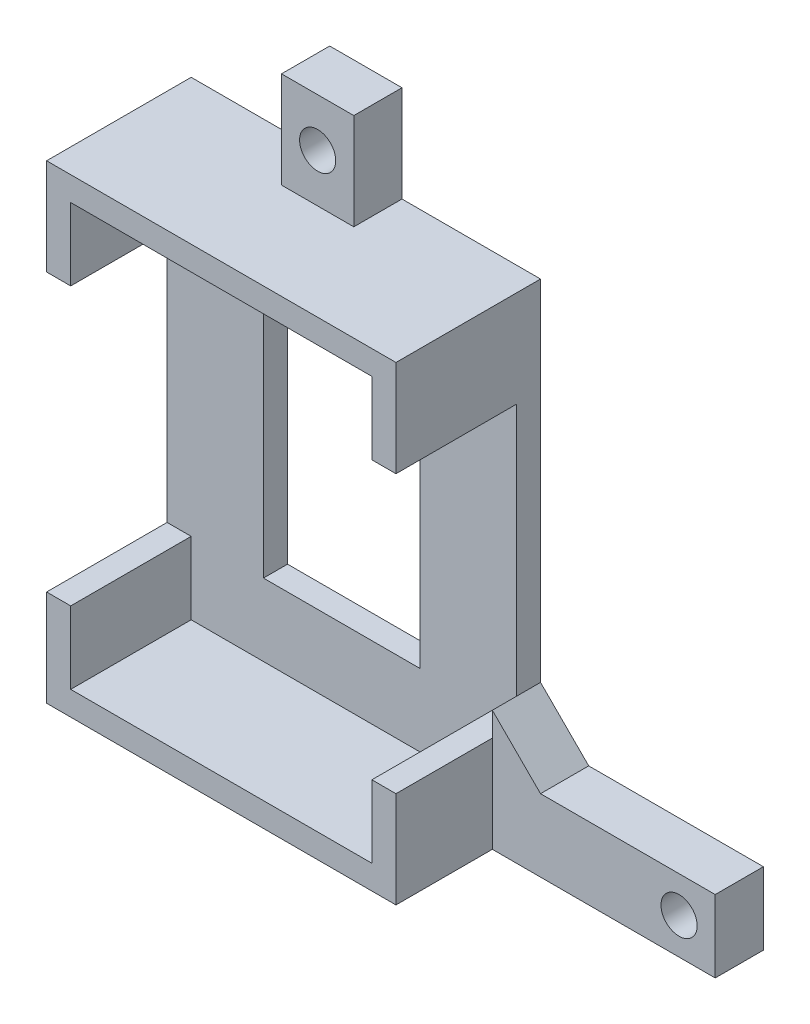
ISO-10303-21;
HEADER;
FILE_DESCRIPTION(('STEP AP214'),'2;1');
FILE_NAME('part.step','',(''),(''),'','','');
FILE_SCHEMA(('AUTOMOTIVE_DESIGN { 1 0 10303 214 1 1 1 1 }'));
ENDSEC;
DATA;
#1=APPLICATION_CONTEXT('core data for automotive mechanical design processes');
#2=APPLICATION_PROTOCOL_DEFINITION('international standard','automotive_design',2000,#1);
#3=PRODUCT_CONTEXT('',#1,'mechanical');
#4=PRODUCT('Part','Part','',(#3));
#5=PRODUCT_RELATED_PRODUCT_CATEGORY('part','',(#4));
#6=PRODUCT_DEFINITION_FORMATION('','',#4);
#7=PRODUCT_DEFINITION_CONTEXT('part definition',#1,'design');
#8=PRODUCT_DEFINITION('design','',#6,#7);
#9=PRODUCT_DEFINITION_SHAPE('','',#8);
#10=(LENGTH_UNIT() NAMED_UNIT(*) SI_UNIT(.MILLI.,.METRE.));
#11=(NAMED_UNIT(*) PLANE_ANGLE_UNIT() SI_UNIT($,.RADIAN.));
#12=(NAMED_UNIT(*) SI_UNIT($,.STERADIAN.) SOLID_ANGLE_UNIT());
#13=UNCERTAINTY_MEASURE_WITH_UNIT(LENGTH_MEASURE(1.E-05),#10,'distance_accuracy_value','');
#14=(GEOMETRIC_REPRESENTATION_CONTEXT(3) GLOBAL_UNCERTAINTY_ASSIGNED_CONTEXT((#13)) GLOBAL_UNIT_ASSIGNED_CONTEXT((#10,
#11,#12)) REPRESENTATION_CONTEXT('',''));
#15=CARTESIAN_POINT('',(0.,0.,0.));
#16=DIRECTION('',(0.,0.,1.));
#17=DIRECTION('',(1.,0.,0.));
#18=AXIS2_PLACEMENT_3D('',#15,#16,#17);
#19=CARTESIAN_POINT('',(-27.,0.,10.));
#20=DIRECTION('',(1.,0.,0.));
#21=DIRECTION('',(0.,0.,-1.));
#22=AXIS2_PLACEMENT_3D('',#19,#20,#21);
#23=PLANE('',#22);
#24=DIRECTION('',(0.,-1.,0.));
#25=VECTOR('',#24,1.);
#26=CARTESIAN_POINT('',(-27.,0.,10.));
#27=LINE('',#26,#25);
#28=CARTESIAN_POINT('',(-27.,6.,10.));
#29=VERTEX_POINT('',#28);
#30=CARTESIAN_POINT('',(-27.,-2.,10.));
#31=VERTEX_POINT('',#30);
#32=EDGE_CURVE('E154',#29,#31,#27,.T.);
#33=ORIENTED_EDGE('',*,*,#32,.F.);
#34=DIRECTION('',(0.,0.,1.));
#35=VECTOR('',#34,1.);
#36=CARTESIAN_POINT('',(-27.,6.,0.));
#37=LINE('',#36,#35);
#38=CARTESIAN_POINT('',(-27.,6.,0.));
#39=VERTEX_POINT('',#38);
#40=EDGE_CURVE('E134',#39,#29,#37,.T.);
#41=ORIENTED_EDGE('',*,*,#40,.F.);
#42=DIRECTION('',(0.,-1.,0.));
#43=VECTOR('',#42,1.);
#44=CARTESIAN_POINT('',(-27.,0.,0.));
#45=LINE('',#44,#43);
#46=CARTESIAN_POINT('',(-27.,-2.,0.));
#47=VERTEX_POINT('',#46);
#48=EDGE_CURVE('E147',#39,#47,#45,.T.);
#49=ORIENTED_EDGE('',*,*,#48,.T.);
#50=DIRECTION('',(0.,0.,-1.));
#51=VECTOR('',#50,1.);
#52=CARTESIAN_POINT('',(-27.,-2.,10.));
#53=LINE('',#52,#51);
#54=EDGE_CURVE('E162',#31,#47,#53,.T.);
#55=ORIENTED_EDGE('',*,*,#54,.F.);
#56=EDGE_LOOP('',(#33,#41,#49,#55));
#57=FACE_BOUND('',#56,.T.);
#58=ADVANCED_FACE('F69',(#57),#23,.F.);
#59=CARTESIAN_POINT('',(-25.,0.,10.));
#60=DIRECTION('',(1.,0.,0.));
#61=DIRECTION('',(0.,0.,-1.));
#62=AXIS2_PLACEMENT_3D('',#59,#60,#61);
#63=PLANE('',#62);
#64=DIRECTION('',(0.,0.,1.));
#65=VECTOR('',#64,1.);
#66=CARTESIAN_POINT('',(-25.,6.,0.));
#67=LINE('',#66,#65);
#68=CARTESIAN_POINT('',(-25.,6.,0.));
#69=VERTEX_POINT('',#68);
#70=CARTESIAN_POINT('',(-25.,6.,10.));
#71=VERTEX_POINT('',#70);
#72=EDGE_CURVE('E131',#69,#71,#67,.T.);
#73=ORIENTED_EDGE('',*,*,#72,.T.);
#74=DIRECTION('',(0.,-1.,0.));
#75=VECTOR('',#74,1.);
#76=CARTESIAN_POINT('',(-25.,0.,10.));
#77=LINE('',#76,#75);
#78=CARTESIAN_POINT('',(-25.,0.,10.));
#79=VERTEX_POINT('',#78);
#80=EDGE_CURVE('E144',#71,#79,#77,.T.);
#81=ORIENTED_EDGE('',*,*,#80,.T.);
#82=DIRECTION('',(0.,0.,-1.));
#83=VECTOR('',#82,1.);
#84=CARTESIAN_POINT('',(-25.,0.,10.));
#85=LINE('',#84,#83);
#86=CARTESIAN_POINT('',(-25.,0.,0.));
#87=VERTEX_POINT('',#86);
#88=EDGE_CURVE('E152',#79,#87,#85,.T.);
#89=ORIENTED_EDGE('',*,*,#88,.T.);
#90=DIRECTION('',(0.,-1.,0.));
#91=VECTOR('',#90,1.);
#92=CARTESIAN_POINT('',(-25.,0.,0.));
#93=LINE('',#92,#91);
#94=EDGE_CURVE('E146',#69,#87,#93,.T.);
#95=ORIENTED_EDGE('',*,*,#94,.F.);
#96=EDGE_LOOP('',(#73,#81,#89,#95));
#97=FACE_BOUND('',#96,.T.);
#98=ADVANCED_FACE('F142',(#97),#63,.T.);
#99=CARTESIAN_POINT('',(0.,0.,10.));
#100=DIRECTION('',(0.,0.,1.));
#101=DIRECTION('',(1.,0.,0.));
#102=AXIS2_PLACEMENT_3D('',#99,#100,#101);
#103=PLANE('',#102);
#104=DIRECTION('',(1.,0.,0.));
#105=VECTOR('',#104,1.);
#106=CARTESIAN_POINT('',(0.,6.,10.));
#107=LINE('',#106,#105);
#108=CARTESIAN_POINT('',(0.,6.,10.));
#109=VERTEX_POINT('',#108);
#110=CARTESIAN_POINT('',(2.,6.,10.));
#111=VERTEX_POINT('',#110);
#112=EDGE_CURVE('E79',#109,#111,#107,.T.);
#113=ORIENTED_EDGE('',*,*,#112,.F.);
#114=DIRECTION('',(0.,1.,0.));
#115=VECTOR('',#114,1.);
#116=CARTESIAN_POINT('',(0.,0.,10.));
#117=LINE('',#116,#115);
#118=CARTESIAN_POINT('',(0.,0.,10.));
#119=VERTEX_POINT('',#118);
#120=EDGE_CURVE('E160',#119,#109,#117,.T.);
#121=ORIENTED_EDGE('',*,*,#120,.F.);
#122=DIRECTION('',(1.,0.,0.));
#123=VECTOR('',#122,1.);
#124=CARTESIAN_POINT('',(0.,0.,10.));
#125=LINE('',#124,#123);
#126=EDGE_CURVE('E151',#79,#119,#125,.T.);
#127=ORIENTED_EDGE('',*,*,#126,.F.);
#128=ORIENTED_EDGE('',*,*,#80,.F.);
#129=DIRECTION('',(1.,0.,0.));
#130=VECTOR('',#129,1.);
#131=CARTESIAN_POINT('',(-25.,6.,10.));
#132=LINE('',#131,#130);
#133=EDGE_CURVE('E128',#29,#71,#132,.T.);
#134=ORIENTED_EDGE('',*,*,#133,.F.);
#135=ORIENTED_EDGE('',*,*,#32,.T.);
#136=DIRECTION('',(1.,0.,0.));
#137=VECTOR('',#136,1.);
#138=CARTESIAN_POINT('',(0.,-2.,10.));
#139=LINE('',#138,#137);
#140=CARTESIAN_POINT('',(2.,-2.,10.));
#141=VERTEX_POINT('',#140);
#142=EDGE_CURVE('E180',#31,#141,#139,.T.);
#143=ORIENTED_EDGE('',*,*,#142,.T.);
#144=DIRECTION('',(0.,1.,0.));
#145=VECTOR('',#144,1.);
#146=CARTESIAN_POINT('',(2.,0.,10.));
#147=LINE('',#146,#145);
#148=EDGE_CURVE('E181',#141,#111,#147,.T.);
#149=ORIENTED_EDGE('',*,*,#148,.T.);
#150=EDGE_LOOP('',(#113,#121,#127,#128,#134,#135,#143,#149));
#151=FACE_BOUND('',#150,.T.);
#152=ADVANCED_FACE('F71',(#151),#103,.T.);
#153=CARTESIAN_POINT('',(0.,0.,0.));
#154=DIRECTION('',(0.,0.,1.));
#155=DIRECTION('',(1.,0.,0.));
#156=AXIS2_PLACEMENT_3D('',#153,#154,#155);
#157=PLANE('',#156);
#158=DIRECTION('',(0.,1.,0.));
#159=VECTOR('',#158,1.);
#160=CARTESIAN_POINT('',(0.,0.,0.));
#161=LINE('',#160,#159);
#162=CARTESIAN_POINT('',(0.,0.,0.));
#163=VERTEX_POINT('',#162);
#164=CARTESIAN_POINT('',(0.,6.,0.));
#165=VERTEX_POINT('',#164);
#166=EDGE_CURVE('E73',#163,#165,#161,.T.);
#167=ORIENTED_EDGE('',*,*,#166,.T.);
#168=DIRECTION('',(1.,0.,0.));
#169=VECTOR('',#168,1.);
#170=CARTESIAN_POINT('',(0.,6.,0.));
#171=LINE('',#170,#169);
#172=CARTESIAN_POINT('',(2.,6.,0.));
#173=VERTEX_POINT('',#172);
#174=EDGE_CURVE('E168',#165,#173,#171,.T.);
#175=ORIENTED_EDGE('',*,*,#174,.T.);
#176=DIRECTION('',(0.,1.,0.));
#177=VECTOR('',#176,1.);
#178=CARTESIAN_POINT('',(2.,0.,0.));
#179=LINE('',#178,#177);
#180=CARTESIAN_POINT('',(2.,-2.,0.));
#181=VERTEX_POINT('',#180);
#182=EDGE_CURVE('E158',#181,#173,#179,.T.);
#183=ORIENTED_EDGE('',*,*,#182,.F.);
#184=DIRECTION('',(1.,0.,0.));
#185=VECTOR('',#184,1.);
#186=CARTESIAN_POINT('',(0.,-2.,0.));
#187=LINE('',#186,#185);
#188=EDGE_CURVE('E191',#47,#181,#187,.T.);
#189=ORIENTED_EDGE('',*,*,#188,.F.);
#190=ORIENTED_EDGE('',*,*,#48,.F.);
#191=DIRECTION('',(1.,0.,0.));
#192=VECTOR('',#191,1.);
#193=CARTESIAN_POINT('',(-25.,6.,0.));
#194=LINE('',#193,#192);
#195=EDGE_CURVE('E164',#39,#69,#194,.T.);
#196=ORIENTED_EDGE('',*,*,#195,.T.);
#197=ORIENTED_EDGE('',*,*,#94,.T.);
#198=DIRECTION('',(1.,0.,0.));
#199=VECTOR('',#198,1.);
#200=CARTESIAN_POINT('',(0.,0.,0.));
#201=LINE('',#200,#199);
#202=EDGE_CURVE('E163',#87,#163,#201,.T.);
#203=ORIENTED_EDGE('',*,*,#202,.T.);
#204=EDGE_LOOP('',(#167,#175,#183,#189,#190,#196,#197,#203));
#205=FACE_BOUND('',#204,.T.);
#206=ADVANCED_FACE('F196',(#205),#157,.F.);
#207=CARTESIAN_POINT('',(2.,0.,10.));
#208=DIRECTION('',(-1.,0.,0.));
#209=DIRECTION('',(0.,-1.,0.));
#210=AXIS2_PLACEMENT_3D('',#207,#208,#209);
#211=PLANE('',#210);
#212=ORIENTED_EDGE('',*,*,#182,.T.);
#213=DIRECTION('',(0.,0.,1.));
#214=VECTOR('',#213,1.);
#215=CARTESIAN_POINT('',(2.,6.,0.));
#216=LINE('',#215,#214);
#217=EDGE_CURVE('E174',#173,#111,#216,.T.);
#218=ORIENTED_EDGE('',*,*,#217,.T.);
#219=ORIENTED_EDGE('',*,*,#148,.F.);
#220=DIRECTION('',(0.,0.,-1.));
#221=VECTOR('',#220,1.);
#222=CARTESIAN_POINT('',(2.,-2.,10.));
#223=LINE('',#222,#221);
#224=EDGE_CURVE('E177',#141,#181,#223,.T.);
#225=ORIENTED_EDGE('',*,*,#224,.T.);
#226=EDGE_LOOP('',(#212,#218,#219,#225));
#227=FACE_BOUND('',#226,.T.);
#228=ADVANCED_FACE('F215',(#227),#211,.F.);
#229=CARTESIAN_POINT('',(0.,-2.,10.));
#230=DIRECTION('',(0.,1.,0.));
#231=DIRECTION('',(0.,0.,1.));
#232=AXIS2_PLACEMENT_3D('',#229,#230,#231);
#233=PLANE('',#232);
#234=ORIENTED_EDGE('',*,*,#188,.T.);
#235=ORIENTED_EDGE('',*,*,#224,.F.);
#236=ORIENTED_EDGE('',*,*,#142,.F.);
#237=ORIENTED_EDGE('',*,*,#54,.T.);
#238=EDGE_LOOP('',(#234,#235,#236,#237));
#239=FACE_BOUND('',#238,.T.);
#240=ADVANCED_FACE('F189',(#239),#233,.F.);
#241=CARTESIAN_POINT('',(0.,0.,10.));
#242=DIRECTION('',(-1.,0.,0.));
#243=DIRECTION('',(0.,-1.,0.));
#244=AXIS2_PLACEMENT_3D('',#241,#242,#243);
#245=PLANE('',#244);
#246=DIRECTION('',(0.,0.,1.));
#247=VECTOR('',#246,1.);
#248=CARTESIAN_POINT('',(0.,6.,0.));
#249=LINE('',#248,#247);
#250=EDGE_CURVE('E13',#165,#109,#249,.T.);
#251=ORIENTED_EDGE('',*,*,#250,.F.);
#252=ORIENTED_EDGE('',*,*,#166,.F.);
#253=DIRECTION('',(0.,0.,-1.));
#254=VECTOR('',#253,1.);
#255=CARTESIAN_POINT('',(0.,0.,10.));
#256=LINE('',#255,#254);
#257=EDGE_CURVE('E138',#119,#163,#256,.T.);
#258=ORIENTED_EDGE('',*,*,#257,.F.);
#259=ORIENTED_EDGE('',*,*,#120,.T.);
#260=EDGE_LOOP('',(#251,#252,#258,#259));
#261=FACE_BOUND('',#260,.T.);
#262=ADVANCED_FACE('F210',(#261),#245,.T.);
#263=CARTESIAN_POINT('',(0.,0.,10.));
#264=DIRECTION('',(0.,1.,0.));
#265=DIRECTION('',(0.,0.,1.));
#266=AXIS2_PLACEMENT_3D('',#263,#264,#265);
#267=PLANE('',#266);
#268=ORIENTED_EDGE('',*,*,#202,.F.);
#269=ORIENTED_EDGE('',*,*,#88,.F.);
#270=ORIENTED_EDGE('',*,*,#126,.T.);
#271=ORIENTED_EDGE('',*,*,#257,.T.);
#272=EDGE_LOOP('',(#268,#269,#270,#271));
#273=FACE_BOUND('',#272,.T.);
#274=ADVANCED_FACE('F208',(#273),#267,.T.);
#275=CARTESIAN_POINT('',(-25.,6.,0.));
#276=DIRECTION('',(0.,-1.,0.));
#277=DIRECTION('',(0.,0.,-1.));
#278=AXIS2_PLACEMENT_3D('',#275,#276,#277);
#279=PLANE('',#278);
#280=ORIENTED_EDGE('',*,*,#133,.T.);
#281=ORIENTED_EDGE('',*,*,#72,.F.);
#282=ORIENTED_EDGE('',*,*,#195,.F.);
#283=ORIENTED_EDGE('',*,*,#40,.T.);
#284=EDGE_LOOP('',(#280,#281,#282,#283));
#285=FACE_BOUND('',#284,.T.);
#286=ADVANCED_FACE('F130',(#285),#279,.F.);
#287=CARTESIAN_POINT('',(0.,6.,0.));
#288=DIRECTION('',(0.,-1.,0.));
#289=DIRECTION('',(0.,0.,-1.));
#290=AXIS2_PLACEMENT_3D('',#287,#288,#289);
#291=PLANE('',#290);
#292=ORIENTED_EDGE('',*,*,#112,.T.);
#293=ORIENTED_EDGE('',*,*,#217,.F.);
#294=ORIENTED_EDGE('',*,*,#174,.F.);
#295=ORIENTED_EDGE('',*,*,#250,.T.);
#296=EDGE_LOOP('',(#292,#293,#294,#295));
#297=FACE_BOUND('',#296,.T.);
#298=ADVANCED_FACE('F213',(#297),#291,.F.);
#299=CLOSED_SHELL('',(#58,#98,#152,#206,#228,#240,#262,#274,#286,#298));
#300=MANIFOLD_SOLID_BREP('B2',#299);
#301=CARTESIAN_POINT('',(0.,37.,10.));
#302=DIRECTION('',(0.,-1.,0.));
#303=DIRECTION('',(0.,0.,-1.));
#304=AXIS2_PLACEMENT_3D('',#301,#302,#303);
#305=PLANE('',#304);
#306=DIRECTION('',(0.,0.,-1.));
#307=VECTOR('',#306,1.);
#308=CARTESIAN_POINT('',(-9.5,37.,2.));
#309=LINE('',#308,#307);
#310=CARTESIAN_POINT('',(-9.5,37.,2.));
#311=VERTEX_POINT('',#310);
#312=CARTESIAN_POINT('',(-9.5,37.,-2.));
#313=VERTEX_POINT('',#312);
#314=EDGE_CURVE('E539',#311,#313,#309,.T.);
#315=ORIENTED_EDGE('',*,*,#314,.F.);
#316=DIRECTION('',(-1.,0.,0.));
#317=VECTOR('',#316,1.);
#318=CARTESIAN_POINT('',(-9.5,37.,2.));
#319=LINE('',#318,#317);
#320=CARTESIAN_POINT('',(-15.5,37.,2.));
#321=VERTEX_POINT('',#320);
#322=EDGE_CURVE('E529',#311,#321,#319,.T.);
#323=ORIENTED_EDGE('',*,*,#322,.T.);
#324=DIRECTION('',(0.,0.,-1.));
#325=VECTOR('',#324,1.);
#326=CARTESIAN_POINT('',(-15.5,37.,2.));
#327=LINE('',#326,#325);
#328=CARTESIAN_POINT('',(-15.5,37.,-2.));
#329=VERTEX_POINT('',#328);
#330=EDGE_CURVE('E552',#321,#329,#327,.T.);
#331=ORIENTED_EDGE('',*,*,#330,.T.);
#332=DIRECTION('',(1.,0.,0.));
#333=VECTOR('',#332,1.);
#334=CARTESIAN_POINT('',(-27.,37.,-2.));
#335=LINE('',#334,#333);
#336=CARTESIAN_POINT('',(-27.,37.,-2.));
#337=VERTEX_POINT('',#336);
#338=EDGE_CURVE('E561',#337,#329,#335,.T.);
#339=ORIENTED_EDGE('',*,*,#338,.F.);
#340=DIRECTION('',(0.,0.,-1.));
#341=VECTOR('',#340,1.);
#342=CARTESIAN_POINT('',(-27.,37.,10.));
#343=LINE('',#342,#341);
#344=CARTESIAN_POINT('',(-27.,37.,10.));
#345=VERTEX_POINT('',#344);
#346=EDGE_CURVE('E627',#345,#337,#343,.T.);
#347=ORIENTED_EDGE('',*,*,#346,.F.);
#348=DIRECTION('',(-1.,0.,0.));
#349=VECTOR('',#348,1.);
#350=CARTESIAN_POINT('',(0.,37.,10.));
#351=LINE('',#350,#349);
#352=CARTESIAN_POINT('',(2.,37.,10.));
#353=VERTEX_POINT('',#352);
#354=EDGE_CURVE('E622',#353,#345,#351,.T.);
#355=ORIENTED_EDGE('',*,*,#354,.F.);
#356=DIRECTION('',(0.,0.,-1.));
#357=VECTOR('',#356,1.);
#358=CARTESIAN_POINT('',(2.,37.,10.));
#359=LINE('',#358,#357);
#360=CARTESIAN_POINT('',(2.,37.,-2.));
#361=VERTEX_POINT('',#360);
#362=EDGE_CURVE('E629',#353,#361,#359,.T.);
#363=ORIENTED_EDGE('',*,*,#362,.T.);
#364=EDGE_CURVE('E559',#313,#361,#335,.T.);
#365=ORIENTED_EDGE('',*,*,#364,.F.);
#366=EDGE_LOOP('',(#315,#323,#331,#339,#347,#355,#363,#365));
#367=FACE_BOUND('',#366,.T.);
#368=ADVANCED_FACE('F297',(#367),#305,.F.);
#369=CARTESIAN_POINT('',(0.,35.,10.));
#370=DIRECTION('',(0.,-1.,0.));
#371=DIRECTION('',(0.,0.,-1.));
#372=AXIS2_PLACEMENT_3D('',#369,#370,#371);
#373=PLANE('',#372);
#374=DIRECTION('',(-1.,0.,0.));
#375=VECTOR('',#374,1.);
#376=CARTESIAN_POINT('',(0.,35.,0.));
#377=LINE('',#376,#375);
#378=CARTESIAN_POINT('',(0.,35.,0.));
#379=VERTEX_POINT('',#378);
#380=CARTESIAN_POINT('',(-25.,35.,0.));
#381=VERTEX_POINT('',#380);
#382=EDGE_CURVE('E611',#379,#381,#377,.T.);
#383=ORIENTED_EDGE('',*,*,#382,.F.);
#384=DIRECTION('',(0.,0.,-1.));
#385=VECTOR('',#384,1.);
#386=CARTESIAN_POINT('',(0.,35.,10.));
#387=LINE('',#386,#385);
#388=CARTESIAN_POINT('',(0.,35.,10.));
#389=VERTEX_POINT('',#388);
#390=EDGE_CURVE('E617',#389,#379,#387,.T.);
#391=ORIENTED_EDGE('',*,*,#390,.F.);
#392=DIRECTION('',(-1.,0.,0.));
#393=VECTOR('',#392,1.);
#394=CARTESIAN_POINT('',(0.,35.,10.));
#395=LINE('',#394,#393);
#396=CARTESIAN_POINT('',(-25.,35.,10.));
#397=VERTEX_POINT('',#396);
#398=EDGE_CURVE('E602',#389,#397,#395,.T.);
#399=ORIENTED_EDGE('',*,*,#398,.T.);
#400=DIRECTION('',(0.,0.,-1.));
#401=VECTOR('',#400,1.);
#402=CARTESIAN_POINT('',(-25.,35.,10.));
#403=LINE('',#402,#401);
#404=EDGE_CURVE('E608',#397,#381,#403,.T.);
#405=ORIENTED_EDGE('',*,*,#404,.T.);
#406=EDGE_LOOP('',(#383,#391,#399,#405));
#407=FACE_BOUND('',#406,.T.);
#408=ADVANCED_FACE('F656',(#407),#373,.T.);
#409=CARTESIAN_POINT('',(-27.,0.,10.));
#410=DIRECTION('',(1.,0.,0.));
#411=DIRECTION('',(0.,0.,-1.));
#412=AXIS2_PLACEMENT_3D('',#409,#410,#411);
#413=PLANE('',#412);
#414=ORIENTED_EDGE('',*,*,#346,.T.);
#415=DIRECTION('',(0.,1.,0.));
#416=VECTOR('',#415,1.);
#417=CARTESIAN_POINT('',(-27.,-2.,-2.));
#418=LINE('',#417,#416);
#419=CARTESIAN_POINT('',(-27.,-2.,-2.));
#420=VERTEX_POINT('',#419);
#421=EDGE_CURVE('E556',#420,#337,#418,.T.);
#422=ORIENTED_EDGE('',*,*,#421,.F.);
#423=DIRECTION('',(0.,0.,1.));
#424=VECTOR('',#423,1.);
#425=CARTESIAN_POINT('',(-27.,-2.,-2.));
#426=LINE('',#425,#424);
#427=CARTESIAN_POINT('',(-27.,-2.,0.));
#428=VERTEX_POINT('',#427);
#429=EDGE_CURVE('E569',#420,#428,#426,.T.);
#430=ORIENTED_EDGE('',*,*,#429,.T.);
#431=DIRECTION('',(0.,1.,0.));
#432=VECTOR('',#431,1.);
#433=CARTESIAN_POINT('',(-27.,-2.,0.));
#434=LINE('',#433,#432);
#435=CARTESIAN_POINT('',(-27.,29.,0.));
#436=VERTEX_POINT('',#435);
#437=EDGE_CURVE('E549',#428,#436,#434,.T.);
#438=ORIENTED_EDGE('',*,*,#437,.T.);
#439=DIRECTION('',(0.,0.,1.));
#440=VECTOR('',#439,1.);
#441=CARTESIAN_POINT('',(-27.,29.,0.));
#442=LINE('',#441,#440);
#443=CARTESIAN_POINT('',(-27.,29.,10.));
#444=VERTEX_POINT('',#443);
#445=EDGE_CURVE('E586',#436,#444,#442,.T.);
#446=ORIENTED_EDGE('',*,*,#445,.T.);
#447=DIRECTION('',(0.,-1.,0.));
#448=VECTOR('',#447,1.);
#449=CARTESIAN_POINT('',(-27.,0.,10.));
#450=LINE('',#449,#448);
#451=EDGE_CURVE('E624',#345,#444,#450,.T.);
#452=ORIENTED_EDGE('',*,*,#451,.F.);
#453=EDGE_LOOP('',(#414,#422,#430,#438,#446,#452));
#454=FACE_BOUND('',#453,.T.);
#455=ADVANCED_FACE('F661',(#454),#413,.F.);
#456=CARTESIAN_POINT('',(-25.,0.,10.));
#457=DIRECTION('',(1.,0.,0.));
#458=DIRECTION('',(0.,0.,-1.));
#459=AXIS2_PLACEMENT_3D('',#456,#457,#458);
#460=PLANE('',#459);
#461=DIRECTION('',(0.,0.,1.));
#462=VECTOR('',#461,1.);
#463=CARTESIAN_POINT('',(-25.,29.,0.));
#464=LINE('',#463,#462);
#465=CARTESIAN_POINT('',(-25.,29.,0.));
#466=VERTEX_POINT('',#465);
#467=CARTESIAN_POINT('',(-25.,29.,10.));
#468=VERTEX_POINT('',#467);
#469=EDGE_CURVE('E595',#466,#468,#464,.T.);
#470=ORIENTED_EDGE('',*,*,#469,.F.);
#471=DIRECTION('',(0.,-1.,0.));
#472=VECTOR('',#471,1.);
#473=CARTESIAN_POINT('',(-25.,0.,0.));
#474=LINE('',#473,#472);
#475=EDGE_CURVE('E603',#381,#466,#474,.T.);
#476=ORIENTED_EDGE('',*,*,#475,.F.);
#477=ORIENTED_EDGE('',*,*,#404,.F.);
#478=DIRECTION('',(0.,-1.,0.));
#479=VECTOR('',#478,1.);
#480=CARTESIAN_POINT('',(-25.,0.,10.));
#481=LINE('',#480,#479);
#482=EDGE_CURVE('E605',#397,#468,#481,.T.);
#483=ORIENTED_EDGE('',*,*,#482,.T.);
#484=EDGE_LOOP('',(#470,#476,#477,#483));
#485=FACE_BOUND('',#484,.T.);
#486=ADVANCED_FACE('F668',(#485),#460,.T.);
#487=CARTESIAN_POINT('',(0.,0.,10.));
#488=DIRECTION('',(-1.,0.,0.));
#489=DIRECTION('',(0.,-1.,0.));
#490=AXIS2_PLACEMENT_3D('',#487,#488,#489);
#491=PLANE('',#490);
#492=DIRECTION('',(0.,0.,1.));
#493=VECTOR('',#492,1.);
#494=CARTESIAN_POINT('',(0.,29.,0.));
#495=LINE('',#494,#493);
#496=CARTESIAN_POINT('',(0.,29.,0.));
#497=VERTEX_POINT('',#496);
#498=CARTESIAN_POINT('',(0.,29.,10.));
#499=VERTEX_POINT('',#498);
#500=EDGE_CURVE('E587',#497,#499,#495,.T.);
#501=ORIENTED_EDGE('',*,*,#500,.T.);
#502=DIRECTION('',(0.,1.,0.));
#503=VECTOR('',#502,1.);
#504=CARTESIAN_POINT('',(0.,0.,10.));
#505=LINE('',#504,#503);
#506=EDGE_CURVE('E600',#499,#389,#505,.T.);
#507=ORIENTED_EDGE('',*,*,#506,.T.);
#508=ORIENTED_EDGE('',*,*,#390,.T.);
#509=DIRECTION('',(0.,1.,0.));
#510=VECTOR('',#509,1.);
#511=CARTESIAN_POINT('',(0.,0.,0.));
#512=LINE('',#511,#510);
#513=EDGE_CURVE('E590',#497,#379,#512,.T.);
#514=ORIENTED_EDGE('',*,*,#513,.F.);
#515=EDGE_LOOP('',(#501,#507,#508,#514));
#516=FACE_BOUND('',#515,.T.);
#517=ADVANCED_FACE('F675',(#516),#491,.T.);
#518=CARTESIAN_POINT('',(2.,0.,10.));
#519=DIRECTION('',(-1.,0.,0.));
#520=DIRECTION('',(0.,-1.,0.));
#521=AXIS2_PLACEMENT_3D('',#518,#519,#520);
#522=PLANE('',#521);
#523=DIRECTION('',(0.,-1.,0.));
#524=VECTOR('',#523,1.);
#525=CARTESIAN_POINT('',(2.,-2.,0.));
#526=LINE('',#525,#524);
#527=CARTESIAN_POINT('',(2.,29.,0.));
#528=VERTEX_POINT('',#527);
#529=CARTESIAN_POINT('',(2.,8.,0.));
#530=VERTEX_POINT('',#529);
#531=EDGE_CURVE('E573',#528,#530,#526,.T.);
#532=ORIENTED_EDGE('',*,*,#531,.T.);
#533=DIRECTION('',(0.,0.,-1.));
#534=VECTOR('',#533,1.);
#535=CARTESIAN_POINT('',(2.,8.,2.));
#536=LINE('',#535,#534);
#537=CARTESIAN_POINT('',(2.,8.,-2.));
#538=VERTEX_POINT('',#537);
#539=EDGE_CURVE('E519',#530,#538,#536,.T.);
#540=ORIENTED_EDGE('',*,*,#539,.T.);
#541=DIRECTION('',(0.,-1.,0.));
#542=VECTOR('',#541,1.);
#543=CARTESIAN_POINT('',(2.,-2.,-2.));
#544=LINE('',#543,#542);
#545=EDGE_CURVE('E564',#361,#538,#544,.T.);
#546=ORIENTED_EDGE('',*,*,#545,.F.);
#547=ORIENTED_EDGE('',*,*,#362,.F.);
#548=DIRECTION('',(0.,1.,0.));
#549=VECTOR('',#548,1.);
#550=CARTESIAN_POINT('',(2.,0.,10.));
#551=LINE('',#550,#549);
#552=CARTESIAN_POINT('',(2.,29.,10.));
#553=VERTEX_POINT('',#552);
#554=EDGE_CURVE('E620',#553,#353,#551,.T.);
#555=ORIENTED_EDGE('',*,*,#554,.F.);
#556=DIRECTION('',(0.,0.,1.));
#557=VECTOR('',#556,1.);
#558=CARTESIAN_POINT('',(2.,29.,0.));
#559=LINE('',#558,#557);
#560=EDGE_CURVE('E583',#528,#553,#559,.T.);
#561=ORIENTED_EDGE('',*,*,#560,.F.);
#562=EDGE_LOOP('',(#532,#540,#546,#547,#555,#561));
#563=FACE_BOUND('',#562,.T.);
#564=ADVANCED_FACE('F299',(#563),#522,.F.);
#565=CARTESIAN_POINT('',(0.,0.,10.));
#566=DIRECTION('',(0.,0.,1.));
#567=DIRECTION('',(1.,0.,0.));
#568=AXIS2_PLACEMENT_3D('',#565,#566,#567);
#569=PLANE('',#568);
#570=DIRECTION('',(-1.,0.,0.));
#571=VECTOR('',#570,1.);
#572=CARTESIAN_POINT('',(0.,29.,10.));
#573=LINE('',#572,#571);
#574=EDGE_CURVE('E584',#553,#499,#573,.T.);
#575=ORIENTED_EDGE('',*,*,#574,.F.);
#576=ORIENTED_EDGE('',*,*,#554,.T.);
#577=ORIENTED_EDGE('',*,*,#354,.T.);
#578=ORIENTED_EDGE('',*,*,#451,.T.);
#579=DIRECTION('',(-1.,0.,0.));
#580=VECTOR('',#579,1.);
#581=CARTESIAN_POINT('',(-25.,29.,10.));
#582=LINE('',#581,#580);
#583=EDGE_CURVE('E579',#468,#444,#582,.T.);
#584=ORIENTED_EDGE('',*,*,#583,.F.);
#585=ORIENTED_EDGE('',*,*,#482,.F.);
#586=ORIENTED_EDGE('',*,*,#398,.F.);
#587=ORIENTED_EDGE('',*,*,#506,.F.);
#588=EDGE_LOOP('',(#575,#576,#577,#578,#584,#585,#586,#587));
#589=FACE_BOUND('',#588,.T.);
#590=ADVANCED_FACE('F670',(#589),#569,.T.);
#591=CARTESIAN_POINT('',(-25.,29.,0.));
#592=DIRECTION('',(0.,1.,0.));
#593=DIRECTION('',(0.,0.,1.));
#594=AXIS2_PLACEMENT_3D('',#591,#592,#593);
#595=PLANE('',#594);
#596=ORIENTED_EDGE('',*,*,#583,.T.);
#597=ORIENTED_EDGE('',*,*,#445,.F.);
#598=DIRECTION('',(-1.,0.,0.));
#599=VECTOR('',#598,1.);
#600=CARTESIAN_POINT('',(-25.,29.,0.));
#601=LINE('',#600,#599);
#602=EDGE_CURVE('E592',#466,#436,#601,.T.);
#603=ORIENTED_EDGE('',*,*,#602,.F.);
#604=ORIENTED_EDGE('',*,*,#469,.T.);
#605=EDGE_LOOP('',(#596,#597,#603,#604));
#606=FACE_BOUND('',#605,.T.);
#607=ADVANCED_FACE('F673',(#606),#595,.F.);
#608=CARTESIAN_POINT('',(0.,29.,0.));
#609=DIRECTION('',(0.,1.,0.));
#610=DIRECTION('',(0.,0.,1.));
#611=AXIS2_PLACEMENT_3D('',#608,#609,#610);
#612=PLANE('',#611);
#613=ORIENTED_EDGE('',*,*,#574,.T.);
#614=ORIENTED_EDGE('',*,*,#500,.F.);
#615=DIRECTION('',(-1.,0.,0.));
#616=VECTOR('',#615,1.);
#617=CARTESIAN_POINT('',(0.,29.,0.));
#618=LINE('',#617,#616);
#619=EDGE_CURVE('E580',#528,#497,#618,.T.);
#620=ORIENTED_EDGE('',*,*,#619,.F.);
#621=ORIENTED_EDGE('',*,*,#560,.T.);
#622=EDGE_LOOP('',(#613,#614,#620,#621));
#623=FACE_BOUND('',#622,.T.);
#624=ADVANCED_FACE('F684',(#623),#612,.F.);
#625=CARTESIAN_POINT('',(0.,0.,0.));
#626=DIRECTION('',(0.,0.,-1.));
#627=DIRECTION('',(-1.,0.,0.));
#628=AXIS2_PLACEMENT_3D('',#625,#626,#627);
#629=PLANE('',#628);
#630=DIRECTION('',(1.,0.,0.));
#631=VECTOR('',#630,1.);
#632=CARTESIAN_POINT('',(-19.,6.,0.));
#633=LINE('',#632,#631);
#634=CARTESIAN_POINT('',(-19.,6.,0.));
#635=VERTEX_POINT('',#634);
#636=CARTESIAN_POINT('',(-6.,6.,0.));
#637=VERTEX_POINT('',#636);
#638=EDGE_CURVE('E460',#635,#637,#633,.T.);
#639=ORIENTED_EDGE('',*,*,#638,.F.);
#640=DIRECTION('',(0.,-1.,0.));
#641=VECTOR('',#640,1.);
#642=CARTESIAN_POINT('',(-19.,29.,0.));
#643=LINE('',#642,#641);
#644=CARTESIAN_POINT('',(-19.,29.,0.));
#645=VERTEX_POINT('',#644);
#646=EDGE_CURVE('E312',#645,#635,#643,.T.);
#647=ORIENTED_EDGE('',*,*,#646,.F.);
#648=DIRECTION('',(-1.,0.,0.));
#649=VECTOR('',#648,1.);
#650=CARTESIAN_POINT('',(-19.,29.,0.));
#651=LINE('',#650,#649);
#652=CARTESIAN_POINT('',(-6.,29.,0.));
#653=VERTEX_POINT('',#652);
#654=EDGE_CURVE('E467',#653,#645,#651,.T.);
#655=ORIENTED_EDGE('',*,*,#654,.F.);
#656=DIRECTION('',(0.,1.,0.));
#657=VECTOR('',#656,1.);
#658=CARTESIAN_POINT('',(-6.,29.,0.));
#659=LINE('',#658,#657);
#660=EDGE_CURVE('E451',#637,#653,#659,.T.);
#661=ORIENTED_EDGE('',*,*,#660,.F.);
#662=EDGE_LOOP('',(#639,#647,#655,#661));
#663=FACE_BOUND('',#662,.T.);
#664=ORIENTED_EDGE('',*,*,#531,.F.);
#665=ORIENTED_EDGE('',*,*,#619,.T.);
#666=ORIENTED_EDGE('',*,*,#513,.T.);
#667=ORIENTED_EDGE('',*,*,#382,.T.);
#668=ORIENTED_EDGE('',*,*,#475,.T.);
#669=ORIENTED_EDGE('',*,*,#602,.T.);
#670=ORIENTED_EDGE('',*,*,#437,.F.);
#671=DIRECTION('',(-1.,0.,0.));
#672=VECTOR('',#671,1.);
#673=CARTESIAN_POINT('',(-27.,-2.,0.));
#674=LINE('',#673,#672);
#675=CARTESIAN_POINT('',(2.,-2.,0.));
#676=VERTEX_POINT('',#675);
#677=EDGE_CURVE('E560',#676,#428,#674,.T.);
#678=ORIENTED_EDGE('',*,*,#677,.F.);
#679=EDGE_CURVE('E572',#530,#676,#526,.T.);
#680=ORIENTED_EDGE('',*,*,#679,.F.);
#681=EDGE_LOOP('',(#664,#665,#666,#667,#668,#669,#670,#678,#680));
#682=FACE_BOUND('',#681,.T.);
#683=ADVANCED_FACE('F464',(#663,#682),#629,.F.);
#684=CARTESIAN_POINT('',(-27.,-2.,-2.));
#685=DIRECTION('',(0.,1.,0.));
#686=DIRECTION('',(-1.,0.,0.));
#687=AXIS2_PLACEMENT_3D('',#684,#685,#686);
#688=PLANE('',#687);
#689=ORIENTED_EDGE('',*,*,#677,.T.);
#690=ORIENTED_EDGE('',*,*,#429,.F.);
#691=DIRECTION('',(-1.,0.,0.));
#692=VECTOR('',#691,1.);
#693=CARTESIAN_POINT('',(-27.,-2.,-2.));
#694=LINE('',#693,#692);
#695=CARTESIAN_POINT('',(20.5,-2.00000000000001,-2.));
#696=VERTEX_POINT('',#695);
#697=EDGE_CURVE('E567',#696,#420,#694,.T.);
#698=ORIENTED_EDGE('',*,*,#697,.F.);
#699=DIRECTION('',(0.,0.,-1.));
#700=VECTOR('',#699,1.);
#701=CARTESIAN_POINT('',(20.5,-2.00000000000001,2.));
#702=LINE('',#701,#700);
#703=CARTESIAN_POINT('',(20.5,-2.00000000000001,2.));
#704=VERTEX_POINT('',#703);
#705=EDGE_CURVE('E510',#704,#696,#702,.T.);
#706=ORIENTED_EDGE('',*,*,#705,.F.);
#707=DIRECTION('',(-1.,0.,0.));
#708=VECTOR('',#707,1.);
#709=CARTESIAN_POINT('',(2.,-2.,2.));
#710=LINE('',#709,#708);
#711=CARTESIAN_POINT('',(2.,-2.,2.));
#712=VERTEX_POINT('',#711);
#713=EDGE_CURVE('E495',#704,#712,#710,.T.);
#714=ORIENTED_EDGE('',*,*,#713,.T.);
#715=DIRECTION('',(0.,0.,-1.));
#716=VECTOR('',#715,1.);
#717=CARTESIAN_POINT('',(2.,-2.,2.));
#718=LINE('',#717,#716);
#719=EDGE_CURVE('E506',#712,#676,#718,.T.);
#720=ORIENTED_EDGE('',*,*,#719,.T.);
#721=EDGE_LOOP('',(#689,#690,#698,#706,#714,#720));
#722=FACE_BOUND('',#721,.T.);
#723=ADVANCED_FACE('F689',(#722),#688,.F.);
#724=CARTESIAN_POINT('',(0.,0.,-2.));
#725=DIRECTION('',(0.,0.,-1.));
#726=DIRECTION('',(-1.,0.,0.));
#727=AXIS2_PLACEMENT_3D('',#724,#725,#726);
#728=PLANE('',#727);
#729=DIRECTION('',(0.,1.,0.));
#730=VECTOR('',#729,1.);
#731=CARTESIAN_POINT('',(-19.,0.,-2.));
#732=LINE('',#731,#730);
#733=CARTESIAN_POINT('',(-19.,6.,-2.));
#734=VERTEX_POINT('',#733);
#735=CARTESIAN_POINT('',(-19.,29.,-2.));
#736=VERTEX_POINT('',#735);
#737=EDGE_CURVE('E67',#734,#736,#732,.T.);
#738=ORIENTED_EDGE('',*,*,#737,.F.);
#739=DIRECTION('',(-1.,0.,0.));
#740=VECTOR('',#739,1.);
#741=CARTESIAN_POINT('',(0.,6.,-2.));
#742=LINE('',#741,#740);
#743=CARTESIAN_POINT('',(-6.,6.,-2.));
#744=VERTEX_POINT('',#743);
#745=EDGE_CURVE('E632',#744,#734,#742,.T.);
#746=ORIENTED_EDGE('',*,*,#745,.F.);
#747=DIRECTION('',(0.,-1.,0.));
#748=VECTOR('',#747,1.);
#749=CARTESIAN_POINT('',(-6.,0.,-2.));
#750=LINE('',#749,#748);
#751=CARTESIAN_POINT('',(-6.,29.,-2.));
#752=VERTEX_POINT('',#751);
#753=EDGE_CURVE('E454',#752,#744,#750,.T.);
#754=ORIENTED_EDGE('',*,*,#753,.F.);
#755=DIRECTION('',(1.,0.,0.));
#756=VECTOR('',#755,1.);
#757=CARTESIAN_POINT('',(0.,29.,-2.));
#758=LINE('',#757,#756);
#759=EDGE_CURVE('E305',#736,#752,#758,.T.);
#760=ORIENTED_EDGE('',*,*,#759,.F.);
#761=EDGE_LOOP('',(#738,#746,#754,#760));
#762=FACE_BOUND('',#761,.T.);
#763=ORIENTED_EDGE('',*,*,#421,.T.);
#764=ORIENTED_EDGE('',*,*,#338,.T.);
#765=DIRECTION('',(0.,1.,0.));
#766=VECTOR('',#765,1.);
#767=CARTESIAN_POINT('',(-15.5,45.,-2.));
#768=LINE('',#767,#766);
#769=CARTESIAN_POINT('',(-15.5,45.,-2.));
#770=VERTEX_POINT('',#769);
#771=EDGE_CURVE('E542',#329,#770,#768,.T.);
#772=ORIENTED_EDGE('',*,*,#771,.T.);
#773=DIRECTION('',(1.,0.,0.));
#774=VECTOR('',#773,1.);
#775=CARTESIAN_POINT('',(-9.5,45.,-2.));
#776=LINE('',#775,#774);
#777=CARTESIAN_POINT('',(-9.5,45.,-2.));
#778=VERTEX_POINT('',#777);
#779=EDGE_CURVE('E530',#770,#778,#776,.T.);
#780=ORIENTED_EDGE('',*,*,#779,.T.);
#781=DIRECTION('',(0.,-1.,0.));
#782=VECTOR('',#781,1.);
#783=CARTESIAN_POINT('',(-9.5,45.,-2.));
#784=LINE('',#783,#782);
#785=EDGE_CURVE('E523',#778,#313,#784,.T.);
#786=ORIENTED_EDGE('',*,*,#785,.T.);
#787=ORIENTED_EDGE('',*,*,#364,.T.);
#788=ORIENTED_EDGE('',*,*,#545,.T.);
#789=DIRECTION('',(0.707106781186544,-0.707106781186552,0.));
#790=VECTOR('',#789,1.);
#791=CARTESIAN_POINT('',(2.,8.,-2.));
#792=LINE('',#791,#790);
#793=CARTESIAN_POINT('',(5.99999999999995,4.,-2.));
#794=VERTEX_POINT('',#793);
#795=EDGE_CURVE('E480',#538,#794,#792,.T.);
#796=ORIENTED_EDGE('',*,*,#795,.T.);
#797=DIRECTION('',(1.,0.,0.));
#798=VECTOR('',#797,1.);
#799=CARTESIAN_POINT('',(5.99999999999995,4.,-2.));
#800=LINE('',#799,#798);
#801=CARTESIAN_POINT('',(20.5,3.99999999999999,-2.));
#802=VERTEX_POINT('',#801);
#803=EDGE_CURVE('E501',#794,#802,#800,.T.);
#804=ORIENTED_EDGE('',*,*,#803,.T.);
#805=DIRECTION('',(0.,-1.,0.));
#806=VECTOR('',#805,1.);
#807=CARTESIAN_POINT('',(20.5,-2.00000000000001,-2.));
#808=LINE('',#807,#806);
#809=EDGE_CURVE('E486',#802,#696,#808,.T.);
#810=ORIENTED_EDGE('',*,*,#809,.T.);
#811=ORIENTED_EDGE('',*,*,#697,.T.);
#812=EDGE_LOOP('',(#763,#764,#772,#780,#786,#787,#788,#796,#804,#810,#811));
#813=FACE_BOUND('',#812,.T.);
#814=CARTESIAN_POINT('',(-12.5,41.,-2.));
#815=DIRECTION('',(0.,0.,-1.));
#816=DIRECTION('',(-1.,0.,0.));
#817=AXIS2_PLACEMENT_3D('',#814,#815,#816);
#818=CIRCLE('',#817,1.5);
#819=CARTESIAN_POINT('',(-14.,41.,-2.));
#820=VERTEX_POINT('',#819);
#821=EDGE_CURVE('E509',#820,#820,#818,.T.);
#822=ORIENTED_EDGE('',*,*,#821,.F.);
#823=EDGE_LOOP('',(#822));
#824=FACE_BOUND('',#823,.T.);
#825=CARTESIAN_POINT('',(17.5,1.,-2.));
#826=DIRECTION('',(0.,0.,-1.));
#827=DIRECTION('',(-1.,0.,0.));
#828=AXIS2_PLACEMENT_3D('',#825,#826,#827);
#829=CIRCLE('',#828,1.5);
#830=CARTESIAN_POINT('',(16.,1.,-2.));
#831=VERTEX_POINT('',#830);
#832=EDGE_CURVE('E474',#831,#831,#829,.T.);
#833=ORIENTED_EDGE('',*,*,#832,.F.);
#834=EDGE_LOOP('',(#833));
#835=FACE_BOUND('',#834,.T.);
#836=ADVANCED_FACE('F640',(#762,#813,#824,#835),#728,.T.);
#837=CARTESIAN_POINT('',(-9.5,45.,2.));
#838=DIRECTION('',(1.,0.,0.));
#839=DIRECTION('',(0.,0.,-1.));
#840=AXIS2_PLACEMENT_3D('',#837,#838,#839);
#841=PLANE('',#840);
#842=ORIENTED_EDGE('',*,*,#785,.F.);
#843=DIRECTION('',(0.,0.,-1.));
#844=VECTOR('',#843,1.);
#845=CARTESIAN_POINT('',(-9.5,45.,2.));
#846=LINE('',#845,#844);
#847=CARTESIAN_POINT('',(-9.5,45.,2.));
#848=VERTEX_POINT('',#847);
#849=EDGE_CURVE('E547',#848,#778,#846,.T.);
#850=ORIENTED_EDGE('',*,*,#849,.F.);
#851=DIRECTION('',(0.,-1.,0.));
#852=VECTOR('',#851,1.);
#853=CARTESIAN_POINT('',(-9.5,45.,2.));
#854=LINE('',#853,#852);
#855=EDGE_CURVE('E526',#848,#311,#854,.T.);
#856=ORIENTED_EDGE('',*,*,#855,.T.);
#857=ORIENTED_EDGE('',*,*,#314,.T.);
#858=EDGE_LOOP('',(#842,#850,#856,#857));
#859=FACE_BOUND('',#858,.T.);
#860=ADVANCED_FACE('F697',(#859),#841,.T.);
#861=CARTESIAN_POINT('',(-9.5,45.,2.));
#862=DIRECTION('',(0.,1.,0.));
#863=DIRECTION('',(0.,0.,1.));
#864=AXIS2_PLACEMENT_3D('',#861,#862,#863);
#865=PLANE('',#864);
#866=ORIENTED_EDGE('',*,*,#779,.F.);
#867=DIRECTION('',(0.,0.,-1.));
#868=VECTOR('',#867,1.);
#869=CARTESIAN_POINT('',(-15.5,45.,2.));
#870=LINE('',#869,#868);
#871=CARTESIAN_POINT('',(-15.5,45.,2.));
#872=VERTEX_POINT('',#871);
#873=EDGE_CURVE('E550',#872,#770,#870,.T.);
#874=ORIENTED_EDGE('',*,*,#873,.F.);
#875=DIRECTION('',(1.,0.,0.));
#876=VECTOR('',#875,1.);
#877=CARTESIAN_POINT('',(-9.5,45.,2.));
#878=LINE('',#877,#876);
#879=EDGE_CURVE('E536',#872,#848,#878,.T.);
#880=ORIENTED_EDGE('',*,*,#879,.T.);
#881=ORIENTED_EDGE('',*,*,#849,.T.);
#882=EDGE_LOOP('',(#866,#874,#880,#881));
#883=FACE_BOUND('',#882,.T.);
#884=ADVANCED_FACE('F700',(#883),#865,.T.);
#885=CARTESIAN_POINT('',(-15.5,45.,2.));
#886=DIRECTION('',(-1.,0.,0.));
#887=DIRECTION('',(0.,-1.,0.));
#888=AXIS2_PLACEMENT_3D('',#885,#886,#887);
#889=PLANE('',#888);
#890=ORIENTED_EDGE('',*,*,#771,.F.);
#891=ORIENTED_EDGE('',*,*,#330,.F.);
#892=DIRECTION('',(0.,1.,0.));
#893=VECTOR('',#892,1.);
#894=CARTESIAN_POINT('',(-15.5,45.,2.));
#895=LINE('',#894,#893);
#896=EDGE_CURVE('E533',#321,#872,#895,.T.);
#897=ORIENTED_EDGE('',*,*,#896,.T.);
#898=ORIENTED_EDGE('',*,*,#873,.T.);
#899=EDGE_LOOP('',(#890,#891,#897,#898));
#900=FACE_BOUND('',#899,.T.);
#901=ADVANCED_FACE('F702',(#900),#889,.T.);
#902=CARTESIAN_POINT('',(0.,0.,2.));
#903=DIRECTION('',(0.,0.,-1.));
#904=DIRECTION('',(-1.,0.,0.));
#905=AXIS2_PLACEMENT_3D('',#902,#903,#904);
#906=PLANE('',#905);
#907=CARTESIAN_POINT('',(-12.5,41.,2.));
#908=DIRECTION('',(0.,0.,-1.));
#909=DIRECTION('',(-1.,0.,0.));
#910=AXIS2_PLACEMENT_3D('',#907,#908,#909);
#911=CIRCLE('',#910,1.5);
#912=CARTESIAN_POINT('',(-14.,41.,2.));
#913=VERTEX_POINT('',#912);
#914=EDGE_CURVE('E520',#913,#913,#911,.T.);
#915=ORIENTED_EDGE('',*,*,#914,.T.);
#916=EDGE_LOOP('',(#915));
#917=FACE_BOUND('',#916,.T.);
#918=ORIENTED_EDGE('',*,*,#855,.F.);
#919=ORIENTED_EDGE('',*,*,#879,.F.);
#920=ORIENTED_EDGE('',*,*,#896,.F.);
#921=ORIENTED_EDGE('',*,*,#322,.F.);
#922=EDGE_LOOP('',(#918,#919,#920,#921));
#923=FACE_BOUND('',#922,.T.);
#924=ADVANCED_FACE('F705',(#917,#923),#906,.F.);
#925=CARTESIAN_POINT('',(-12.5,41.,2.));
#926=DIRECTION('',(0.,0.,-1.));
#927=DIRECTION('',(-1.,0.,0.));
#928=AXIS2_PLACEMENT_3D('',#925,#926,#927);
#929=CYLINDRICAL_SURFACE('',#928,1.5);
#930=ORIENTED_EDGE('',*,*,#914,.F.);
#931=EDGE_LOOP('',(#930));
#932=FACE_BOUND('',#931,.T.);
#933=ORIENTED_EDGE('',*,*,#821,.T.);
#934=EDGE_LOOP('',(#933));
#935=FACE_BOUND('',#934,.T.);
#936=ADVANCED_FACE('F712',(#932,#935),#929,.F.);
#937=CARTESIAN_POINT('',(20.5,-2.00000000000001,2.));
#938=DIRECTION('',(1.,0.,0.));
#939=DIRECTION('',(0.,1.,0.));
#940=AXIS2_PLACEMENT_3D('',#937,#938,#939);
#941=PLANE('',#940);
#942=ORIENTED_EDGE('',*,*,#809,.F.);
#943=DIRECTION('',(0.,0.,-1.));
#944=VECTOR('',#943,1.);
#945=CARTESIAN_POINT('',(20.5,3.99999999999999,2.));
#946=LINE('',#945,#944);
#947=CARTESIAN_POINT('',(20.5,3.99999999999999,2.));
#948=VERTEX_POINT('',#947);
#949=EDGE_CURVE('E513',#948,#802,#946,.T.);
#950=ORIENTED_EDGE('',*,*,#949,.F.);
#951=DIRECTION('',(0.,-1.,0.));
#952=VECTOR('',#951,1.);
#953=CARTESIAN_POINT('',(20.5,-2.00000000000001,2.));
#954=LINE('',#953,#952);
#955=EDGE_CURVE('E492',#948,#704,#954,.T.);
#956=ORIENTED_EDGE('',*,*,#955,.T.);
#957=ORIENTED_EDGE('',*,*,#705,.T.);
#958=EDGE_LOOP('',(#942,#950,#956,#957));
#959=FACE_BOUND('',#958,.T.);
#960=ADVANCED_FACE('F716',(#959),#941,.T.);
#961=CARTESIAN_POINT('',(5.99999999999995,4.,2.));
#962=DIRECTION('',(0.,1.,0.));
#963=DIRECTION('',(-1.,0.,0.));
#964=AXIS2_PLACEMENT_3D('',#961,#962,#963);
#965=PLANE('',#964);
#966=ORIENTED_EDGE('',*,*,#803,.F.);
#967=DIRECTION('',(0.,0.,-1.));
#968=VECTOR('',#967,1.);
#969=CARTESIAN_POINT('',(5.99999999999995,4.,2.));
#970=LINE('',#969,#968);
#971=CARTESIAN_POINT('',(5.99999999999995,4.,2.));
#972=VERTEX_POINT('',#971);
#973=EDGE_CURVE('E515',#972,#794,#970,.T.);
#974=ORIENTED_EDGE('',*,*,#973,.F.);
#975=DIRECTION('',(1.,0.,0.));
#976=VECTOR('',#975,1.);
#977=CARTESIAN_POINT('',(5.99999999999995,4.,2.));
#978=LINE('',#977,#976);
#979=EDGE_CURVE('E489',#972,#948,#978,.T.);
#980=ORIENTED_EDGE('',*,*,#979,.T.);
#981=ORIENTED_EDGE('',*,*,#949,.T.);
#982=EDGE_LOOP('',(#966,#974,#980,#981));
#983=FACE_BOUND('',#982,.T.);
#984=ADVANCED_FACE('F725',(#983),#965,.T.);
#985=CARTESIAN_POINT('',(2.,8.,2.));
#986=DIRECTION('',(0.707106781186552,0.707106781186544,0.));
#987=DIRECTION('',(-0.707106781186544,0.707106781186552,0.));
#988=AXIS2_PLACEMENT_3D('',#985,#986,#987);
#989=PLANE('',#988);
#990=ORIENTED_EDGE('',*,*,#795,.F.);
#991=ORIENTED_EDGE('',*,*,#539,.F.);
#992=CARTESIAN_POINT('',(2.,8.,2.));
#993=VERTEX_POINT('',#992);
#994=EDGE_CURVE('E498',#993,#530,#536,.T.);
#995=ORIENTED_EDGE('',*,*,#994,.F.);
#996=DIRECTION('',(0.707106781186544,-0.707106781186552,0.));
#997=VECTOR('',#996,1.);
#998=CARTESIAN_POINT('',(2.,8.,2.));
#999=LINE('',#998,#997);
#1000=EDGE_CURVE('E485',#993,#972,#999,.T.);
#1001=ORIENTED_EDGE('',*,*,#1000,.T.);
#1002=ORIENTED_EDGE('',*,*,#973,.T.);
#1003=EDGE_LOOP('',(#990,#991,#995,#1001,#1002));
#1004=FACE_BOUND('',#1003,.T.);
#1005=ADVANCED_FACE('F721',(#1004),#989,.T.);
#1006=CARTESIAN_POINT('',(2.,4.,2.));
#1007=DIRECTION('',(-1.,0.,0.));
#1008=DIRECTION('',(0.,-1.,0.));
#1009=AXIS2_PLACEMENT_3D('',#1006,#1007,#1008);
#1010=PLANE('',#1009);
#1011=ORIENTED_EDGE('',*,*,#994,.T.);
#1012=ORIENTED_EDGE('',*,*,#679,.T.);
#1013=ORIENTED_EDGE('',*,*,#719,.F.);
#1014=DIRECTION('',(0.,1.,0.));
#1015=VECTOR('',#1014,1.);
#1016=CARTESIAN_POINT('',(2.,-2.,2.));
#1017=LINE('',#1016,#1015);
#1018=EDGE_CURVE('E483',#712,#993,#1017,.T.);
#1019=ORIENTED_EDGE('',*,*,#1018,.T.);
#1020=EDGE_LOOP('',(#1011,#1012,#1013,#1019));
#1021=FACE_BOUND('',#1020,.T.);
#1022=ADVANCED_FACE('F718',(#1021),#1010,.T.);
#1023=CARTESIAN_POINT('',(0.,0.,2.));
#1024=DIRECTION('',(0.,0.,-1.));
#1025=DIRECTION('',(-1.,0.,0.));
#1026=AXIS2_PLACEMENT_3D('',#1023,#1024,#1025);
#1027=PLANE('',#1026);
#1028=CARTESIAN_POINT('',(17.5,1.,2.));
#1029=DIRECTION('',(0.,0.,-1.));
#1030=DIRECTION('',(-1.,0.,0.));
#1031=AXIS2_PLACEMENT_3D('',#1028,#1029,#1030);
#1032=CIRCLE('',#1031,1.5);
#1033=CARTESIAN_POINT('',(16.,1.,2.));
#1034=VERTEX_POINT('',#1033);
#1035=EDGE_CURVE('E477',#1034,#1034,#1032,.T.);
#1036=ORIENTED_EDGE('',*,*,#1035,.T.);
#1037=EDGE_LOOP('',(#1036));
#1038=FACE_BOUND('',#1037,.T.);
#1039=ORIENTED_EDGE('',*,*,#1018,.F.);
#1040=ORIENTED_EDGE('',*,*,#713,.F.);
#1041=ORIENTED_EDGE('',*,*,#955,.F.);
#1042=ORIENTED_EDGE('',*,*,#979,.F.);
#1043=ORIENTED_EDGE('',*,*,#1000,.F.);
#1044=EDGE_LOOP('',(#1039,#1040,#1041,#1042,#1043));
#1045=FACE_BOUND('',#1044,.T.);
#1046=ADVANCED_FACE('F651',(#1038,#1045),#1027,.F.);
#1047=CARTESIAN_POINT('',(17.5,1.,2.));
#1048=DIRECTION('',(0.,0.,-1.));
#1049=DIRECTION('',(-1.,0.,0.));
#1050=AXIS2_PLACEMENT_3D('',#1047,#1048,#1049);
#1051=CYLINDRICAL_SURFACE('',#1050,1.5);
#1052=ORIENTED_EDGE('',*,*,#1035,.F.);
#1053=EDGE_LOOP('',(#1052));
#1054=FACE_BOUND('',#1053,.T.);
#1055=ORIENTED_EDGE('',*,*,#832,.T.);
#1056=EDGE_LOOP('',(#1055));
#1057=FACE_BOUND('',#1056,.T.);
#1058=ADVANCED_FACE('F644',(#1054,#1057),#1051,.F.);
#1059=CARTESIAN_POINT('',(-19.,29.,-4.));
#1060=DIRECTION('',(-1.,0.,0.));
#1061=DIRECTION('',(0.,-1.,0.));
#1062=AXIS2_PLACEMENT_3D('',#1059,#1060,#1061);
#1063=PLANE('',#1062);
#1064=ORIENTED_EDGE('',*,*,#737,.T.);
#1065=DIRECTION('',(0.,0.,1.));
#1066=VECTOR('',#1065,1.);
#1067=CARTESIAN_POINT('',(-19.,29.,-4.));
#1068=LINE('',#1067,#1066);
#1069=EDGE_CURVE('E472',#736,#645,#1068,.T.);
#1070=ORIENTED_EDGE('',*,*,#1069,.T.);
#1071=ORIENTED_EDGE('',*,*,#646,.T.);
#1072=DIRECTION('',(0.,0.,1.));
#1073=VECTOR('',#1072,1.);
#1074=CARTESIAN_POINT('',(-19.,6.,-4.));
#1075=LINE('',#1074,#1073);
#1076=EDGE_CURVE('E457',#734,#635,#1075,.T.);
#1077=ORIENTED_EDGE('',*,*,#1076,.F.);
#1078=EDGE_LOOP('',(#1064,#1070,#1071,#1077));
#1079=FACE_BOUND('',#1078,.T.);
#1080=ADVANCED_FACE('F642',(#1079),#1063,.F.);
#1081=CARTESIAN_POINT('',(-19.,29.,-4.));
#1082=DIRECTION('',(0.,1.,0.));
#1083=DIRECTION('',(0.,0.,1.));
#1084=AXIS2_PLACEMENT_3D('',#1081,#1082,#1083);
#1085=PLANE('',#1084);
#1086=ORIENTED_EDGE('',*,*,#759,.T.);
#1087=DIRECTION('',(0.,0.,1.));
#1088=VECTOR('',#1087,1.);
#1089=CARTESIAN_POINT('',(-6.,29.,-4.));
#1090=LINE('',#1089,#1088);
#1091=EDGE_CURVE('E456',#752,#653,#1090,.T.);
#1092=ORIENTED_EDGE('',*,*,#1091,.T.);
#1093=ORIENTED_EDGE('',*,*,#654,.T.);
#1094=ORIENTED_EDGE('',*,*,#1069,.F.);
#1095=EDGE_LOOP('',(#1086,#1092,#1093,#1094));
#1096=FACE_BOUND('',#1095,.T.);
#1097=ADVANCED_FACE('F637',(#1096),#1085,.F.);
#1098=CARTESIAN_POINT('',(-6.,29.,-4.));
#1099=DIRECTION('',(1.,0.,0.));
#1100=DIRECTION('',(0.,1.,0.));
#1101=AXIS2_PLACEMENT_3D('',#1098,#1099,#1100);
#1102=PLANE('',#1101);
#1103=ORIENTED_EDGE('',*,*,#753,.T.);
#1104=DIRECTION('',(0.,0.,1.));
#1105=VECTOR('',#1104,1.);
#1106=CARTESIAN_POINT('',(-6.,6.,-4.));
#1107=LINE('',#1106,#1105);
#1108=EDGE_CURVE('E320',#744,#637,#1107,.T.);
#1109=ORIENTED_EDGE('',*,*,#1108,.T.);
#1110=ORIENTED_EDGE('',*,*,#660,.T.);
#1111=ORIENTED_EDGE('',*,*,#1091,.F.);
#1112=EDGE_LOOP('',(#1103,#1109,#1110,#1111));
#1113=FACE_BOUND('',#1112,.T.);
#1114=ADVANCED_FACE('F448',(#1113),#1102,.F.);
#1115=CARTESIAN_POINT('',(-19.,6.,-4.));
#1116=DIRECTION('',(0.,-1.,0.));
#1117=DIRECTION('',(0.,0.,-1.));
#1118=AXIS2_PLACEMENT_3D('',#1115,#1116,#1117);
#1119=PLANE('',#1118);
#1120=ORIENTED_EDGE('',*,*,#745,.T.);
#1121=ORIENTED_EDGE('',*,*,#1076,.T.);
#1122=ORIENTED_EDGE('',*,*,#638,.T.);
#1123=ORIENTED_EDGE('',*,*,#1108,.F.);
#1124=EDGE_LOOP('',(#1120,#1121,#1122,#1123));
#1125=FACE_BOUND('',#1124,.T.);
#1126=ADVANCED_FACE('F461',(#1125),#1119,.F.);
#1127=CLOSED_SHELL('',(#368,#408,#455,#486,#517,#564,#590,#607,#624,#683,#723,#836,#860,#884,
#901,#924,#936,#960,#984,#1005,#1022,#1046,#1058,#1080,#1097,#1114,#1126));
#1128=MANIFOLD_SOLID_BREP('B7',#1127);
#1129=ADVANCED_BREP_SHAPE_REPRESENTATION('',(#18,#300,#1128),#14);
#1130=SHAPE_DEFINITION_REPRESENTATION(#9,#1129);
ENDSEC;
END-ISO-10303-21;
